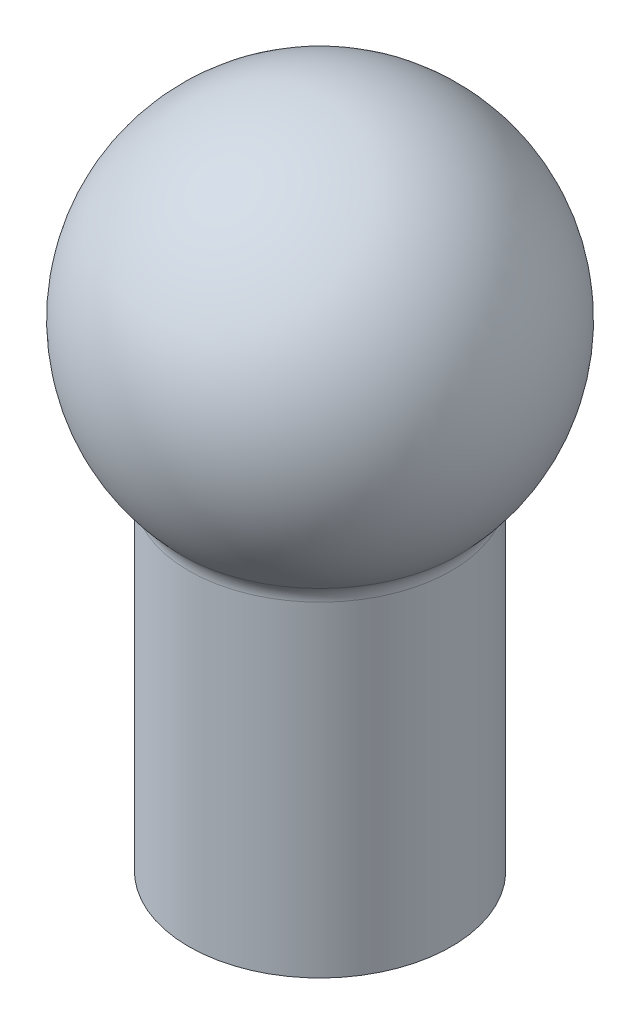
ISO-10303-21;
HEADER;
FILE_DESCRIPTION(('STEP AP214'),'2;1');
FILE_NAME('part.step','',(''),(''),'','','');
FILE_SCHEMA(('AUTOMOTIVE_DESIGN { 1 0 10303 214 1 1 1 1 }'));
ENDSEC;
DATA;
#1=APPLICATION_CONTEXT('core data for automotive mechanical design processes');
#2=APPLICATION_PROTOCOL_DEFINITION('international standard','automotive_design',2000,#1);
#3=PRODUCT_CONTEXT('',#1,'mechanical');
#4=PRODUCT('Part','Part','',(#3));
#5=PRODUCT_RELATED_PRODUCT_CATEGORY('part','',(#4));
#6=PRODUCT_DEFINITION_FORMATION('','',#4);
#7=PRODUCT_DEFINITION_CONTEXT('part definition',#1,'design');
#8=PRODUCT_DEFINITION('design','',#6,#7);
#9=PRODUCT_DEFINITION_SHAPE('','',#8);
#10=(LENGTH_UNIT() NAMED_UNIT(*) SI_UNIT(.MILLI.,.METRE.));
#11=(NAMED_UNIT(*) PLANE_ANGLE_UNIT() SI_UNIT($,.RADIAN.));
#12=(NAMED_UNIT(*) SI_UNIT($,.STERADIAN.) SOLID_ANGLE_UNIT());
#13=UNCERTAINTY_MEASURE_WITH_UNIT(LENGTH_MEASURE(1.E-05),#10,'distance_accuracy_value','');
#14=(GEOMETRIC_REPRESENTATION_CONTEXT(3) GLOBAL_UNCERTAINTY_ASSIGNED_CONTEXT((#13)) GLOBAL_UNIT_ASSIGNED_CONTEXT((#10,
#11,#12)) REPRESENTATION_CONTEXT('',''));
#15=CARTESIAN_POINT('',(0.,0.,0.));
#16=DIRECTION('',(0.,0.,1.));
#17=DIRECTION('',(1.,0.,0.));
#18=AXIS2_PLACEMENT_3D('',#15,#16,#17);
#19=CARTESIAN_POINT('',(0.,0.,0.));
#20=DIRECTION('',(0.,-1.,0.));
#21=DIRECTION('',(-1.,0.,0.));
#22=AXIS2_PLACEMENT_3D('',#19,#20,#21);
#23=SPHERICAL_SURFACE('',#22,8.1);
#24=CARTESIAN_POINT('',(0.,-5.6688191190125,0.));
#25=DIRECTION('',(0.,1.,0.));
#26=DIRECTION('',(0.,0.,1.));
#27=AXIS2_PLACEMENT_3D('',#24,#25,#26);
#28=CIRCLE('',#27,5.78571428571428);
#29=CARTESIAN_POINT('',(0.,-5.6688191190125,5.78571428571428));
#30=VERTEX_POINT('',#29);
#31=EDGE_CURVE('E10',#30,#30,#28,.T.);
#32=ORIENTED_EDGE('',*,*,#31,.T.);
#33=EDGE_LOOP('',(#32));
#34=FACE_BOUND('',#33,.T.);
#35=ADVANCED_FACE('F33',(#34),#23,.T.);
#36=CARTESIAN_POINT('',(0.,0.,0.));
#37=DIRECTION('',(0.,-1.,0.));
#38=DIRECTION('',(0.,0.,-1.));
#39=AXIS2_PLACEMENT_3D('',#36,#37,#38);
#40=CYLINDRICAL_SURFACE('',#39,5.5);
#41=CARTESIAN_POINT('',(0.,-6.36867333123627,0.));
#42=DIRECTION('',(0.,1.,0.));
#43=DIRECTION('',(0.,0.,1.));
#44=AXIS2_PLACEMENT_3D('',#41,#42,#43);
#45=CIRCLE('',#44,5.5);
#46=CARTESIAN_POINT('',(0.,-6.36867333123627,5.5));
#47=VERTEX_POINT('',#46);
#48=EDGE_CURVE('E40',#47,#47,#45,.F.);
#49=ORIENTED_EDGE('',*,*,#48,.T.);
#50=EDGE_LOOP('',(#49));
#51=FACE_BOUND('',#50,.T.);
#52=CARTESIAN_POINT('',(0.,-20.,0.));
#53=DIRECTION('',(0.,-1.,0.));
#54=DIRECTION('',(0.,0.,-1.));
#55=AXIS2_PLACEMENT_3D('',#52,#53,#54);
#56=CIRCLE('',#55,5.5);
#57=CARTESIAN_POINT('',(0.,-20.,-5.5));
#58=VERTEX_POINT('',#57);
#59=EDGE_CURVE('E44',#58,#58,#56,.T.);
#60=ORIENTED_EDGE('',*,*,#59,.F.);
#61=EDGE_LOOP('',(#60));
#62=FACE_BOUND('',#61,.T.);
#63=ADVANCED_FACE('F53',(#51,#62),#40,.T.);
#64=CARTESIAN_POINT('',(0.,-20.,0.));
#65=DIRECTION('',(0.,1.,0.));
#66=DIRECTION('',(0.,0.,1.));
#67=AXIS2_PLACEMENT_3D('',#64,#65,#66);
#68=PLANE('',#67);
#69=ORIENTED_EDGE('',*,*,#59,.T.);
#70=EDGE_LOOP('',(#69));
#71=FACE_BOUND('',#70,.T.);
#72=ADVANCED_FACE('F51',(#71),#68,.F.);
#73=CARTESIAN_POINT('',(0.,-6.36867333123627,0.));
#74=DIRECTION('',(0.,1.,0.));
#75=DIRECTION('',(0.,0.,1.));
#76=AXIS2_PLACEMENT_3D('',#73,#74,#75);
#77=TOROIDAL_SURFACE('',#76,6.5,1.);
#78=ORIENTED_EDGE('',*,*,#31,.F.);
#79=EDGE_LOOP('',(#78));
#80=FACE_BOUND('',#79,.T.);
#81=ORIENTED_EDGE('',*,*,#48,.F.);
#82=EDGE_LOOP('',(#81));
#83=FACE_BOUND('',#82,.T.);
#84=ADVANCED_FACE('F35',(#80,#83),#77,.F.);
#85=CLOSED_SHELL('',(#35,#63,#72,#84));
#86=MANIFOLD_SOLID_BREP('B2',#85);
#87=ADVANCED_BREP_SHAPE_REPRESENTATION('',(#18,#86),#14);
#88=SHAPE_DEFINITION_REPRESENTATION(#9,#87);
ENDSEC;
END-ISO-10303-21;
